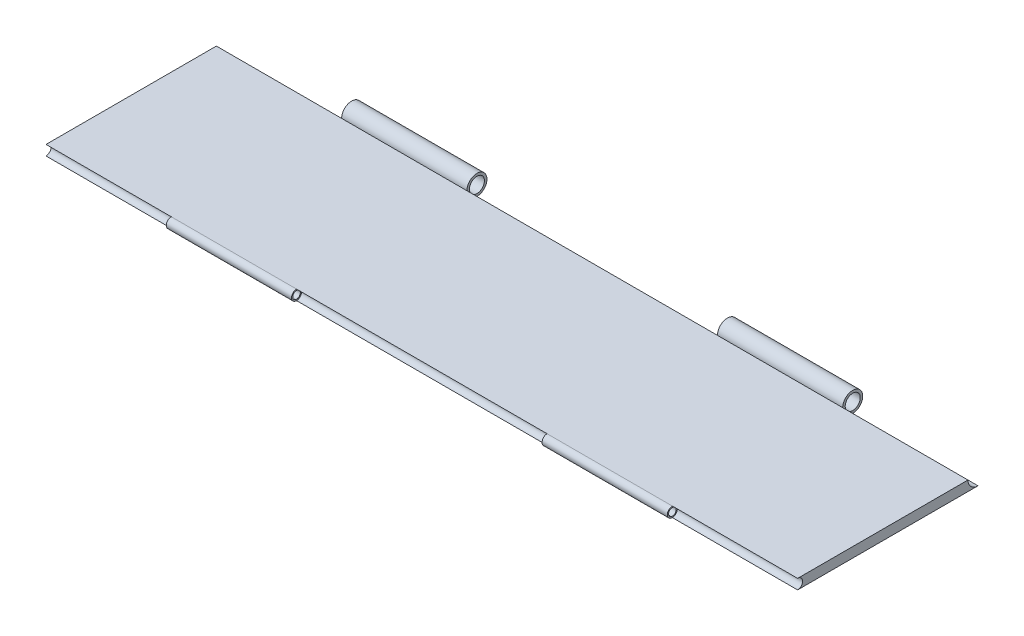
ISO-10303-21;
HEADER;
FILE_DESCRIPTION(('STEP AP214'),'2;1');
FILE_NAME('part.step','',(''),(''),'','','');
FILE_SCHEMA(('AUTOMOTIVE_DESIGN { 1 0 10303 214 1 1 1 1 }'));
ENDSEC;
DATA;
#1=APPLICATION_CONTEXT('core data for automotive mechanical design processes');
#2=APPLICATION_PROTOCOL_DEFINITION('international standard','automotive_design',2000,#1);
#3=PRODUCT_CONTEXT('',#1,'mechanical');
#4=PRODUCT('Part','Part','',(#3));
#5=PRODUCT_RELATED_PRODUCT_CATEGORY('part','',(#4));
#6=PRODUCT_DEFINITION_FORMATION('','',#4);
#7=PRODUCT_DEFINITION_CONTEXT('part definition',#1,'design');
#8=PRODUCT_DEFINITION('design','',#6,#7);
#9=PRODUCT_DEFINITION_SHAPE('','',#8);
#10=(LENGTH_UNIT() NAMED_UNIT(*) SI_UNIT(.MILLI.,.METRE.));
#11=(NAMED_UNIT(*) PLANE_ANGLE_UNIT() SI_UNIT($,.RADIAN.));
#12=(NAMED_UNIT(*) SI_UNIT($,.STERADIAN.) SOLID_ANGLE_UNIT());
#13=UNCERTAINTY_MEASURE_WITH_UNIT(LENGTH_MEASURE(1.E-05),#10,'distance_accuracy_value','');
#14=(GEOMETRIC_REPRESENTATION_CONTEXT(3) GLOBAL_UNCERTAINTY_ASSIGNED_CONTEXT((#13)) GLOBAL_UNIT_ASSIGNED_CONTEXT((#10,
#11,#12)) REPRESENTATION_CONTEXT('',''));
#15=CARTESIAN_POINT('',(0.,0.,0.));
#16=DIRECTION('',(0.,0.,1.));
#17=DIRECTION('',(1.,0.,0.));
#18=AXIS2_PLACEMENT_3D('',#15,#16,#17);
#19=CARTESIAN_POINT('',(98.0225988700565,8.,-5.95350282485887));
#20=DIRECTION('',(1.,0.,0.));
#21=DIRECTION('',(0.,0.,-1.));
#22=AXIS2_PLACEMENT_3D('',#19,#20,#21);
#23=PLANE('',#22);
#24=CARTESIAN_POINT('',(98.0225988700565,4.,-1.94350282485878));
#25=DIRECTION('',(1.,0.,0.));
#26=DIRECTION('',(0.,0.,-1.));
#27=AXIS2_PLACEMENT_3D('',#24,#25,#26);
#28=CIRCLE('',#27,3.);
#29=CARTESIAN_POINT('',(98.0225988700565,4.,-4.94350282485878));
#30=VERTEX_POINT('',#29);
#31=EDGE_CURVE('E72',#30,#30,#28,.F.);
#32=ORIENTED_EDGE('',*,*,#31,.T.);
#33=EDGE_LOOP('',(#32));
#34=FACE_BOUND('',#33,.T.);
#35=CARTESIAN_POINT('',(98.0225988700565,4.,-1.94350282485878));
#36=DIRECTION('',(1.,0.,0.));
#37=DIRECTION('',(0.,0.,-1.));
#38=AXIS2_PLACEMENT_3D('',#35,#36,#37);
#39=CIRCLE('',#38,4.);
#40=CARTESIAN_POINT('',(98.0225988700565,4.,-5.94350282485878));
#41=VERTEX_POINT('',#40);
#42=EDGE_CURVE('E64',#41,#41,#39,.F.);
#43=ORIENTED_EDGE('',*,*,#42,.F.);
#44=EDGE_LOOP('',(#43));
#45=FACE_BOUND('',#44,.T.);
#46=ADVANCED_FACE('F60',(#34,#45),#23,.T.);
#47=CARTESIAN_POINT('',(48.0225988700565,7.99999999999999,-5.95350282485887));
#48=DIRECTION('',(-1.,0.,0.));
#49=DIRECTION('',(0.,0.,1.));
#50=AXIS2_PLACEMENT_3D('',#47,#48,#49);
#51=PLANE('',#50);
#52=CARTESIAN_POINT('',(48.0225988700565,4.,-1.9435028248588));
#53=DIRECTION('',(-1.,0.,0.));
#54=DIRECTION('',(0.,0.,1.));
#55=AXIS2_PLACEMENT_3D('',#52,#53,#54);
#56=CIRCLE('',#55,3.);
#57=CARTESIAN_POINT('',(48.0225988700565,4.,1.0564971751412));
#58=VERTEX_POINT('',#57);
#59=EDGE_CURVE('E74',#58,#58,#56,.F.);
#60=ORIENTED_EDGE('',*,*,#59,.T.);
#61=EDGE_LOOP('',(#60));
#62=FACE_BOUND('',#61,.T.);
#63=CARTESIAN_POINT('',(48.0225988700565,4.,-1.9435028248588));
#64=DIRECTION('',(-1.,0.,0.));
#65=DIRECTION('',(0.,0.,1.));
#66=AXIS2_PLACEMENT_3D('',#63,#64,#65);
#67=CIRCLE('',#66,4.);
#68=CARTESIAN_POINT('',(48.0225988700565,4.,2.0564971751412));
#69=VERTEX_POINT('',#68);
#70=EDGE_CURVE('E12',#69,#69,#67,.F.);
#71=ORIENTED_EDGE('',*,*,#70,.F.);
#72=EDGE_LOOP('',(#71));
#73=FACE_BOUND('',#72,.T.);
#74=ADVANCED_FACE('F81',(#62,#73),#51,.T.);
#75=CARTESIAN_POINT('',(-151.977401129944,4.,-1.94350282485888));
#76=DIRECTION('',(1.,0.,0.));
#77=DIRECTION('',(0.,0.,-1.));
#78=AXIS2_PLACEMENT_3D('',#75,#76,#77);
#79=CYLINDRICAL_SURFACE('',#78,3.);
#80=ORIENTED_EDGE('',*,*,#59,.F.);
#81=EDGE_LOOP('',(#80));
#82=FACE_BOUND('',#81,.T.);
#83=ORIENTED_EDGE('',*,*,#31,.F.);
#84=EDGE_LOOP('',(#83));
#85=FACE_BOUND('',#84,.T.);
#86=ADVANCED_FACE('F84',(#82,#85),#79,.F.);
#87=CARTESIAN_POINT('',(-151.977401129944,4.,-1.94350282485888));
#88=DIRECTION('',(1.,0.,0.));
#89=DIRECTION('',(0.,0.,-1.));
#90=AXIS2_PLACEMENT_3D('',#87,#88,#89);
#91=CYLINDRICAL_SURFACE('',#90,4.);
#92=ORIENTED_EDGE('',*,*,#70,.T.);
#93=EDGE_LOOP('',(#92));
#94=FACE_BOUND('',#93,.T.);
#95=ORIENTED_EDGE('',*,*,#42,.T.);
#96=EDGE_LOOP('',(#95));
#97=FACE_BOUND('',#96,.T.);
#98=ADVANCED_FACE('F62',(#94,#97),#91,.T.);
#99=CLOSED_SHELL('',(#46,#74,#86,#98));
#100=MANIFOLD_SOLID_BREP('B2',#99);
#101=CARTESIAN_POINT('',(-51.9774011299435,8.,-5.95350282485887));
#102=DIRECTION('',(1.,0.,0.));
#103=DIRECTION('',(0.,0.,-1.));
#104=AXIS2_PLACEMENT_3D('',#101,#102,#103);
#105=PLANE('',#104);
#106=CARTESIAN_POINT('',(-51.9774011299435,4.,-1.94350282485884));
#107=DIRECTION('',(1.,0.,0.));
#108=DIRECTION('',(0.,0.,-1.));
#109=AXIS2_PLACEMENT_3D('',#106,#107,#108);
#110=CIRCLE('',#109,3.);
#111=CARTESIAN_POINT('',(-51.9774011299435,4.,-4.94350282485884));
#112=VERTEX_POINT('',#111);
#113=EDGE_CURVE('E135',#112,#112,#110,.F.);
#114=ORIENTED_EDGE('',*,*,#113,.T.);
#115=EDGE_LOOP('',(#114));
#116=FACE_BOUND('',#115,.T.);
#117=CARTESIAN_POINT('',(-51.9774011299435,4.,-1.94350282485884));
#118=DIRECTION('',(1.,0.,0.));
#119=DIRECTION('',(0.,0.,-1.));
#120=AXIS2_PLACEMENT_3D('',#117,#118,#119);
#121=CIRCLE('',#120,4.);
#122=CARTESIAN_POINT('',(-51.9774011299435,4.,-5.94350282485884));
#123=VERTEX_POINT('',#122);
#124=EDGE_CURVE('E139',#123,#123,#121,.F.);
#125=ORIENTED_EDGE('',*,*,#124,.F.);
#126=EDGE_LOOP('',(#125));
#127=FACE_BOUND('',#126,.T.);
#128=ADVANCED_FACE('F131',(#116,#127),#105,.T.);
#129=CARTESIAN_POINT('',(-101.977401129944,7.99999999999999,-5.95350282485887));
#130=DIRECTION('',(-1.,0.,0.));
#131=DIRECTION('',(0.,0.,1.));
#132=AXIS2_PLACEMENT_3D('',#129,#130,#131);
#133=PLANE('',#132);
#134=CARTESIAN_POINT('',(-101.977401129944,4.,-1.94350282485886));
#135=DIRECTION('',(-1.,0.,0.));
#136=DIRECTION('',(0.,0.,1.));
#137=AXIS2_PLACEMENT_3D('',#134,#135,#136);
#138=CIRCLE('',#137,3.);
#139=CARTESIAN_POINT('',(-101.977401129944,4.,1.05649717514114));
#140=VERTEX_POINT('',#139);
#141=EDGE_CURVE('E145',#140,#140,#138,.F.);
#142=ORIENTED_EDGE('',*,*,#141,.T.);
#143=EDGE_LOOP('',(#142));
#144=FACE_BOUND('',#143,.T.);
#145=CARTESIAN_POINT('',(-101.977401129944,4.,-1.94350282485886));
#146=DIRECTION('',(-1.,0.,0.));
#147=DIRECTION('',(0.,0.,1.));
#148=AXIS2_PLACEMENT_3D('',#145,#146,#147);
#149=CIRCLE('',#148,4.);
#150=CARTESIAN_POINT('',(-101.977401129944,4.,2.05649717514114));
#151=VERTEX_POINT('',#150);
#152=EDGE_CURVE('E59',#151,#151,#149,.F.);
#153=ORIENTED_EDGE('',*,*,#152,.F.);
#154=EDGE_LOOP('',(#153));
#155=FACE_BOUND('',#154,.T.);
#156=ADVANCED_FACE('F156',(#144,#155),#133,.T.);
#157=CARTESIAN_POINT('',(-151.977401129944,4.,-1.94350282485888));
#158=DIRECTION('',(1.,0.,0.));
#159=DIRECTION('',(0.,0.,-1.));
#160=AXIS2_PLACEMENT_3D('',#157,#158,#159);
#161=CYLINDRICAL_SURFACE('',#160,3.);
#162=ORIENTED_EDGE('',*,*,#141,.F.);
#163=EDGE_LOOP('',(#162));
#164=FACE_BOUND('',#163,.T.);
#165=ORIENTED_EDGE('',*,*,#113,.F.);
#166=EDGE_LOOP('',(#165));
#167=FACE_BOUND('',#166,.T.);
#168=ADVANCED_FACE('F154',(#164,#167),#161,.F.);
#169=CARTESIAN_POINT('',(-151.977401129944,4.,-1.94350282485888));
#170=DIRECTION('',(1.,0.,0.));
#171=DIRECTION('',(0.,0.,-1.));
#172=AXIS2_PLACEMENT_3D('',#169,#170,#171);
#173=CYLINDRICAL_SURFACE('',#172,4.);
#174=ORIENTED_EDGE('',*,*,#152,.T.);
#175=EDGE_LOOP('',(#174));
#176=FACE_BOUND('',#175,.T.);
#177=ORIENTED_EDGE('',*,*,#124,.T.);
#178=EDGE_LOOP('',(#177));
#179=FACE_BOUND('',#178,.T.);
#180=ADVANCED_FACE('F133',(#176,#179),#173,.T.);
#181=CLOSED_SHELL('',(#128,#156,#168,#180));
#182=MANIFOLD_SOLID_BREP('B7',#181);
#183=CARTESIAN_POINT('',(-151.977401129944,2.,70.0564971751411));
#184=DIRECTION('',(1.,0.,0.));
#185=DIRECTION('',(0.,0.,-1.));
#186=AXIS2_PLACEMENT_3D('',#183,#184,#185);
#187=CYLINDRICAL_SURFACE('',#186,2.);
#188=CARTESIAN_POINT('',(48.0225988700565,2.,70.0564971751412));
#189=DIRECTION('',(1.,0.,0.));
#190=DIRECTION('',(0.,0.,-1.));
#191=AXIS2_PLACEMENT_3D('',#188,#189,#190);
#192=CIRCLE('',#191,2.);
#193=CARTESIAN_POINT('',(48.0225988700565,4.,70.0564971751412));
#194=VERTEX_POINT('',#193);
#195=CARTESIAN_POINT('',(48.0225988700565,0.,70.0564971751412));
#196=VERTEX_POINT('',#195);
#197=EDGE_CURVE('E129',#194,#196,#192,.F.);
#198=ORIENTED_EDGE('',*,*,#197,.F.);
#199=DIRECTION('',(1.,0.,0.));
#200=VECTOR('',#199,1.);
#201=CARTESIAN_POINT('',(-151.977401129944,4.,70.0564971751412));
#202=LINE('',#201,#200);
#203=CARTESIAN_POINT('',(-51.9774011299435,4.,70.0564971751412));
#204=VERTEX_POINT('',#203);
#205=EDGE_CURVE('E215',#204,#194,#202,.T.);
#206=ORIENTED_EDGE('',*,*,#205,.F.);
#207=CARTESIAN_POINT('',(-51.9774011299435,2.,70.0564971751412));
#208=DIRECTION('',(1.,0.,0.));
#209=DIRECTION('',(0.,0.,-1.));
#210=AXIS2_PLACEMENT_3D('',#207,#208,#209);
#211=CIRCLE('',#210,2.);
#212=CARTESIAN_POINT('',(-51.9774011299435,0.,70.0564971751412));
#213=VERTEX_POINT('',#212);
#214=EDGE_CURVE('E260',#204,#213,#211,.F.);
#215=ORIENTED_EDGE('',*,*,#214,.T.);
#216=DIRECTION('',(1.,0.,0.));
#217=VECTOR('',#216,1.);
#218=CARTESIAN_POINT('',(-151.977401129944,0.,70.0564971751412));
#219=LINE('',#218,#217);
#220=EDGE_CURVE('E311',#213,#196,#219,.T.);
#221=ORIENTED_EDGE('',*,*,#220,.T.);
#222=EDGE_LOOP('',(#198,#206,#215,#221));
#223=FACE_BOUND('',#222,.T.);
#224=ADVANCED_FACE('F193',(#223),#187,.F.);
#225=CARTESIAN_POINT('',(-101.977401129944,2.,70.0564971751411));
#226=DIRECTION('',(1.,0.,0.));
#227=DIRECTION('',(0.,0.,-1.));
#228=AXIS2_PLACEMENT_3D('',#225,#226,#227);
#229=CIRCLE('',#228,2.);
#230=CARTESIAN_POINT('',(-101.977401129944,4.,70.0564971751412));
#231=VERTEX_POINT('',#230);
#232=CARTESIAN_POINT('',(-101.977401129944,0.,70.0564971751412));
#233=VERTEX_POINT('',#232);
#234=EDGE_CURVE('E292',#231,#233,#229,.F.);
#235=ORIENTED_EDGE('',*,*,#234,.F.);
#236=CARTESIAN_POINT('',(-151.977401129944,4.,70.0564971751411));
#237=VERTEX_POINT('',#236);
#238=EDGE_CURVE('E282',#237,#231,#202,.T.);
#239=ORIENTED_EDGE('',*,*,#238,.F.);
#240=CARTESIAN_POINT('',(-151.977401129944,2.,70.0564971751411));
#241=DIRECTION('',(1.,0.,0.));
#242=DIRECTION('',(0.,0.,-1.));
#243=AXIS2_PLACEMENT_3D('',#240,#241,#242);
#244=CIRCLE('',#243,2.);
#245=CARTESIAN_POINT('',(-151.977401129944,0.,70.0564971751412));
#246=VERTEX_POINT('',#245);
#247=EDGE_CURVE('E331',#246,#237,#244,.T.);
#248=ORIENTED_EDGE('',*,*,#247,.F.);
#249=EDGE_CURVE('E298',#246,#233,#219,.T.);
#250=ORIENTED_EDGE('',*,*,#249,.T.);
#251=EDGE_LOOP('',(#235,#239,#248,#250));
#252=FACE_BOUND('',#251,.T.);
#253=ADVANCED_FACE('F359',(#252),#187,.F.);
#254=CARTESIAN_POINT('',(-151.977401129943,4.,-1.94350282485876));
#255=DIRECTION('',(1.,0.,0.));
#256=DIRECTION('',(0.,0.,-1.));
#257=AXIS2_PLACEMENT_3D('',#254,#255,#256);
#258=PLANE('',#257);
#259=DIRECTION('',(0.,0.,1.));
#260=VECTOR('',#259,1.);
#261=CARTESIAN_POINT('',(-151.977401129943,0.,-1.94350282485876));
#262=LINE('',#261,#260);
#263=CARTESIAN_POINT('',(-151.977401129944,0.,-1.94350282485888));
#264=VERTEX_POINT('',#263);
#265=EDGE_CURVE('E293',#264,#246,#262,.T.);
#266=ORIENTED_EDGE('',*,*,#265,.T.);
#267=ORIENTED_EDGE('',*,*,#247,.T.);
#268=DIRECTION('',(0.,0.,1.));
#269=VECTOR('',#268,1.);
#270=CARTESIAN_POINT('',(-151.977401129943,4.,-1.94350282485876));
#271=LINE('',#270,#269);
#272=CARTESIAN_POINT('',(-151.977401129944,4.,2.05649717514113));
#273=VERTEX_POINT('',#272);
#274=EDGE_CURVE('E280',#273,#237,#271,.T.);
#275=ORIENTED_EDGE('',*,*,#274,.F.);
#276=CARTESIAN_POINT('',(-151.977401129944,4.,-1.94350282485888));
#277=DIRECTION('',(1.,0.,0.));
#278=DIRECTION('',(0.,0.,-1.));
#279=AXIS2_PLACEMENT_3D('',#276,#277,#278);
#280=CIRCLE('',#279,4.);
#281=EDGE_CURVE('E342',#273,#264,#280,.T.);
#282=ORIENTED_EDGE('',*,*,#281,.T.);
#283=EDGE_LOOP('',(#266,#267,#275,#282));
#284=FACE_BOUND('',#283,.T.);
#285=ADVANCED_FACE('F195',(#284),#258,.F.);
#286=CARTESIAN_POINT('',(148.022598870057,4.,-1.94350282485876));
#287=DIRECTION('',(-1.,0.,0.));
#288=DIRECTION('',(0.,0.,1.));
#289=AXIS2_PLACEMENT_3D('',#286,#287,#288);
#290=PLANE('',#289);
#291=DIRECTION('',(0.,0.,-1.));
#292=VECTOR('',#291,1.);
#293=CARTESIAN_POINT('',(148.022598870057,4.,-1.94350282485876));
#294=LINE('',#293,#292);
#295=CARTESIAN_POINT('',(148.022598870056,4.,70.0564971751412));
#296=VERTEX_POINT('',#295);
#297=CARTESIAN_POINT('',(148.022598870057,4.,2.05649717514124));
#298=VERTEX_POINT('',#297);
#299=EDGE_CURVE('E289',#296,#298,#294,.T.);
#300=ORIENTED_EDGE('',*,*,#299,.F.);
#301=CARTESIAN_POINT('',(148.022598870056,2.,70.0564971751412));
#302=DIRECTION('',(1.,0.,0.));
#303=DIRECTION('',(0.,0.,-1.));
#304=AXIS2_PLACEMENT_3D('',#301,#302,#303);
#305=CIRCLE('',#304,2.);
#306=CARTESIAN_POINT('',(148.022598870056,0.,70.0564971751412));
#307=VERTEX_POINT('',#306);
#308=EDGE_CURVE('E276',#307,#296,#305,.T.);
#309=ORIENTED_EDGE('',*,*,#308,.F.);
#310=DIRECTION('',(0.,0.,-1.));
#311=VECTOR('',#310,1.);
#312=CARTESIAN_POINT('',(148.022598870057,0.,-1.94350282485876));
#313=LINE('',#312,#311);
#314=CARTESIAN_POINT('',(148.022598870057,0.,-1.94350282485876));
#315=VERTEX_POINT('',#314);
#316=EDGE_CURVE('E300',#307,#315,#313,.T.);
#317=ORIENTED_EDGE('',*,*,#316,.T.);
#318=CARTESIAN_POINT('',(148.022598870057,4.,-1.94350282485876));
#319=DIRECTION('',(1.,0.,0.));
#320=DIRECTION('',(0.,0.,-1.));
#321=AXIS2_PLACEMENT_3D('',#318,#319,#320);
#322=CIRCLE('',#321,4.);
#323=EDGE_CURVE('E340',#298,#315,#322,.T.);
#324=ORIENTED_EDGE('',*,*,#323,.F.);
#325=EDGE_LOOP('',(#300,#309,#317,#324));
#326=FACE_BOUND('',#325,.T.);
#327=ADVANCED_FACE('F351',(#326),#290,.F.);
#328=CARTESIAN_POINT('',(0.,4.,0.));
#329=DIRECTION('',(0.,1.,0.));
#330=DIRECTION('',(0.,0.,1.));
#331=AXIS2_PLACEMENT_3D('',#328,#329,#330);
#332=PLANE('',#331);
#333=DIRECTION('',(1.,0.,0.));
#334=VECTOR('',#333,1.);
#335=CARTESIAN_POINT('',(-151.977401129944,4.,2.05649717514113));
#336=LINE('',#335,#334);
#337=EDGE_CURVE('E297',#273,#298,#336,.T.);
#338=ORIENTED_EDGE('',*,*,#337,.F.);
#339=ORIENTED_EDGE('',*,*,#274,.T.);
#340=ORIENTED_EDGE('',*,*,#238,.T.);
#341=EDGE_CURVE('E285',#231,#204,#202,.T.);
#342=ORIENTED_EDGE('',*,*,#341,.T.);
#343=ORIENTED_EDGE('',*,*,#205,.T.);
#344=CARTESIAN_POINT('',(98.0225988700565,4.,70.0564971751412));
#345=VERTEX_POINT('',#344);
#346=EDGE_CURVE('E265',#194,#345,#202,.T.);
#347=ORIENTED_EDGE('',*,*,#346,.T.);
#348=EDGE_CURVE('E273',#345,#296,#202,.T.);
#349=ORIENTED_EDGE('',*,*,#348,.T.);
#350=ORIENTED_EDGE('',*,*,#299,.T.);
#351=EDGE_LOOP('',(#338,#339,#340,#342,#343,#347,#349,#350));
#352=FACE_BOUND('',#351,.T.);
#353=ADVANCED_FACE('F284',(#352),#332,.T.);
#354=CARTESIAN_POINT('',(0.,0.,0.));
#355=DIRECTION('',(0.,1.,0.));
#356=DIRECTION('',(0.,0.,1.));
#357=AXIS2_PLACEMENT_3D('',#354,#355,#356);
#358=PLANE('',#357);
#359=ORIENTED_EDGE('',*,*,#265,.F.);
#360=DIRECTION('',(-1.,0.,0.));
#361=VECTOR('',#360,1.);
#362=CARTESIAN_POINT('',(-151.977401129943,0.,-1.94350282485876));
#363=LINE('',#362,#361);
#364=EDGE_CURVE('E304',#315,#264,#363,.T.);
#365=ORIENTED_EDGE('',*,*,#364,.F.);
#366=ORIENTED_EDGE('',*,*,#316,.F.);
#367=CARTESIAN_POINT('',(98.0225988700565,0.,70.0564971751412));
#368=VERTEX_POINT('',#367);
#369=EDGE_CURVE('E296',#368,#307,#219,.T.);
#370=ORIENTED_EDGE('',*,*,#369,.F.);
#371=EDGE_CURVE('E268',#196,#368,#219,.T.);
#372=ORIENTED_EDGE('',*,*,#371,.F.);
#373=ORIENTED_EDGE('',*,*,#220,.F.);
#374=EDGE_CURVE('E301',#233,#213,#219,.T.);
#375=ORIENTED_EDGE('',*,*,#374,.F.);
#376=ORIENTED_EDGE('',*,*,#249,.F.);
#377=EDGE_LOOP('',(#359,#365,#366,#370,#372,#373,#375,#376));
#378=FACE_BOUND('',#377,.T.);
#379=ADVANCED_FACE('F319',(#378),#358,.F.);
#380=CARTESIAN_POINT('',(-151.977401129944,4.,-1.94350282485888));
#381=DIRECTION('',(1.,0.,0.));
#382=DIRECTION('',(0.,0.,-1.));
#383=AXIS2_PLACEMENT_3D('',#380,#381,#382);
#384=CYLINDRICAL_SURFACE('',#383,4.);
#385=ORIENTED_EDGE('',*,*,#337,.T.);
#386=ORIENTED_EDGE('',*,*,#323,.T.);
#387=ORIENTED_EDGE('',*,*,#364,.T.);
#388=ORIENTED_EDGE('',*,*,#281,.F.);
#389=EDGE_LOOP('',(#385,#386,#387,#388));
#390=FACE_BOUND('',#389,.T.);
#391=ADVANCED_FACE('F347',(#390),#384,.F.);
#392=ORIENTED_EDGE('',*,*,#348,.F.);
#393=CARTESIAN_POINT('',(98.0225988700565,2.,70.0564971751412));
#394=DIRECTION('',(1.,0.,0.));
#395=DIRECTION('',(0.,0.,-1.));
#396=AXIS2_PLACEMENT_3D('',#393,#394,#395);
#397=CIRCLE('',#396,2.);
#398=EDGE_CURVE('E201',#345,#368,#397,.F.);
#399=ORIENTED_EDGE('',*,*,#398,.T.);
#400=ORIENTED_EDGE('',*,*,#369,.T.);
#401=ORIENTED_EDGE('',*,*,#308,.T.);
#402=EDGE_LOOP('',(#392,#399,#400,#401));
#403=FACE_BOUND('',#402,.T.);
#404=ADVANCED_FACE('F274',(#403),#187,.F.);
#405=CARTESIAN_POINT('',(-51.9774011299435,2.,70.0564971751411));
#406=DIRECTION('',(1.,0.,0.));
#407=DIRECTION('',(0.,0.,-1.));
#408=AXIS2_PLACEMENT_3D('',#405,#406,#407);
#409=PLANE('',#408);
#410=CARTESIAN_POINT('',(-51.9774011299435,2.,70.0564971751411));
#411=DIRECTION('',(1.,0.,0.));
#412=DIRECTION('',(0.,0.,-1.));
#413=AXIS2_PLACEMENT_3D('',#410,#411,#412);
#414=CIRCLE('',#413,2.);
#415=EDGE_CURVE('E325',#204,#213,#414,.T.);
#416=ORIENTED_EDGE('',*,*,#415,.T.);
#417=ORIENTED_EDGE('',*,*,#214,.F.);
#418=EDGE_LOOP('',(#416,#417));
#419=FACE_BOUND('',#418,.T.);
#420=CARTESIAN_POINT('',(-51.9774011299435,2.,70.0564971751411));
#421=DIRECTION('',(1.,0.,0.));
#422=DIRECTION('',(0.,0.,-1.));
#423=AXIS2_PLACEMENT_3D('',#420,#421,#422);
#424=CIRCLE('',#423,1.5);
#425=CARTESIAN_POINT('',(-51.9774011299435,2.,68.5564971751411));
#426=VERTEX_POINT('',#425);
#427=EDGE_CURVE('E333',#426,#426,#424,.T.);
#428=ORIENTED_EDGE('',*,*,#427,.F.);
#429=EDGE_LOOP('',(#428));
#430=FACE_BOUND('',#429,.T.);
#431=ADVANCED_FACE('F328',(#419,#430),#409,.T.);
#432=CARTESIAN_POINT('',(-101.977401129944,2.,70.0564971751411));
#433=DIRECTION('',(1.,0.,0.));
#434=DIRECTION('',(0.,0.,-1.));
#435=AXIS2_PLACEMENT_3D('',#432,#433,#434);
#436=PLANE('',#435);
#437=CARTESIAN_POINT('',(-101.977401129944,2.,70.0564971751411));
#438=DIRECTION('',(1.,0.,0.));
#439=DIRECTION('',(0.,0.,-1.));
#440=AXIS2_PLACEMENT_3D('',#437,#438,#439);
#441=CIRCLE('',#440,2.);
#442=EDGE_CURVE('E327',#231,#233,#441,.T.);
#443=ORIENTED_EDGE('',*,*,#442,.F.);
#444=ORIENTED_EDGE('',*,*,#234,.T.);
#445=EDGE_LOOP('',(#443,#444));
#446=FACE_BOUND('',#445,.T.);
#447=CARTESIAN_POINT('',(-101.977401129944,2.,70.0564971751411));
#448=DIRECTION('',(1.,0.,0.));
#449=DIRECTION('',(0.,0.,-1.));
#450=AXIS2_PLACEMENT_3D('',#447,#448,#449);
#451=CIRCLE('',#450,1.5);
#452=CARTESIAN_POINT('',(-101.977401129944,2.,68.5564971751411));
#453=VERTEX_POINT('',#452);
#454=EDGE_CURVE('E336',#453,#453,#451,.T.);
#455=ORIENTED_EDGE('',*,*,#454,.T.);
#456=EDGE_LOOP('',(#455));
#457=FACE_BOUND('',#456,.T.);
#458=ADVANCED_FACE('F357',(#446,#457),#436,.F.);
#459=CARTESIAN_POINT('',(-51.9774011299435,2.,70.0564971751411));
#460=DIRECTION('',(-1.,0.,0.));
#461=DIRECTION('',(0.,0.,1.));
#462=AXIS2_PLACEMENT_3D('',#459,#460,#461);
#463=CYLINDRICAL_SURFACE('',#462,2.);
#464=ORIENTED_EDGE('',*,*,#341,.F.);
#465=ORIENTED_EDGE('',*,*,#442,.T.);
#466=ORIENTED_EDGE('',*,*,#374,.T.);
#467=ORIENTED_EDGE('',*,*,#415,.F.);
#468=EDGE_LOOP('',(#464,#465,#466,#467));
#469=FACE_BOUND('',#468,.T.);
#470=ADVANCED_FACE('F324',(#469),#463,.T.);
#471=CARTESIAN_POINT('',(-51.9774011299435,2.,70.0564971751411));
#472=DIRECTION('',(-1.,0.,0.));
#473=DIRECTION('',(0.,0.,1.));
#474=AXIS2_PLACEMENT_3D('',#471,#472,#473);
#475=CYLINDRICAL_SURFACE('',#474,1.5);
#476=ORIENTED_EDGE('',*,*,#427,.T.);
#477=EDGE_LOOP('',(#476));
#478=FACE_BOUND('',#477,.T.);
#479=ORIENTED_EDGE('',*,*,#454,.F.);
#480=EDGE_LOOP('',(#479));
#481=FACE_BOUND('',#480,.T.);
#482=ADVANCED_FACE('F410',(#478,#481),#475,.F.);
#483=CARTESIAN_POINT('',(48.0225988700565,2.,70.0564971751412));
#484=DIRECTION('',(1.,0.,0.));
#485=DIRECTION('',(0.,0.,-1.));
#486=AXIS2_PLACEMENT_3D('',#483,#484,#485);
#487=CYLINDRICAL_SURFACE('',#486,2.);
#488=ORIENTED_EDGE('',*,*,#346,.F.);
#489=CARTESIAN_POINT('',(48.0225988700565,2.,70.0564971751412));
#490=DIRECTION('',(1.,0.,0.));
#491=DIRECTION('',(0.,0.,-1.));
#492=AXIS2_PLACEMENT_3D('',#489,#490,#491);
#493=CIRCLE('',#492,2.);
#494=EDGE_CURVE('E269',#194,#196,#493,.T.);
#495=ORIENTED_EDGE('',*,*,#494,.T.);
#496=ORIENTED_EDGE('',*,*,#371,.T.);
#497=CARTESIAN_POINT('',(98.0225988700565,2.,70.0564971751412));
#498=DIRECTION('',(1.,0.,0.));
#499=DIRECTION('',(0.,0.,-1.));
#500=AXIS2_PLACEMENT_3D('',#497,#498,#499);
#501=CIRCLE('',#500,2.);
#502=EDGE_CURVE('E207',#345,#368,#501,.T.);
#503=ORIENTED_EDGE('',*,*,#502,.F.);
#504=EDGE_LOOP('',(#488,#495,#496,#503));
#505=FACE_BOUND('',#504,.T.);
#506=ADVANCED_FACE('F262',(#505),#487,.T.);
#507=CARTESIAN_POINT('',(48.0225988700565,2.,70.0564971751412));
#508=DIRECTION('',(1.,0.,0.));
#509=DIRECTION('',(0.,0.,-1.));
#510=AXIS2_PLACEMENT_3D('',#507,#508,#509);
#511=PLANE('',#510);
#512=CARTESIAN_POINT('',(48.0225988700565,2.,70.0564971751412));
#513=DIRECTION('',(1.,0.,0.));
#514=DIRECTION('',(0.,0.,-1.));
#515=AXIS2_PLACEMENT_3D('',#512,#513,#514);
#516=CIRCLE('',#515,1.5);
#517=CARTESIAN_POINT('',(48.0225988700565,2.,68.5564971751412));
#518=VERTEX_POINT('',#517);
#519=EDGE_CURVE('E270',#518,#518,#516,.T.);
#520=ORIENTED_EDGE('',*,*,#519,.T.);
#521=EDGE_LOOP('',(#520));
#522=FACE_BOUND('',#521,.T.);
#523=ORIENTED_EDGE('',*,*,#494,.F.);
#524=ORIENTED_EDGE('',*,*,#197,.T.);
#525=EDGE_LOOP('',(#523,#524));
#526=FACE_BOUND('',#525,.T.);
#527=ADVANCED_FACE('F409',(#522,#526),#511,.F.);
#528=CARTESIAN_POINT('',(98.0225988700565,2.,70.0564971751412));
#529=DIRECTION('',(1.,0.,0.));
#530=DIRECTION('',(0.,0.,-1.));
#531=AXIS2_PLACEMENT_3D('',#528,#529,#530);
#532=PLANE('',#531);
#533=CARTESIAN_POINT('',(98.0225988700565,2.,70.0564971751412));
#534=DIRECTION('',(1.,0.,0.));
#535=DIRECTION('',(0.,0.,-1.));
#536=AXIS2_PLACEMENT_3D('',#533,#534,#535);
#537=CIRCLE('',#536,1.5);
#538=CARTESIAN_POINT('',(98.0225988700565,2.,68.5564971751412));
#539=VERTEX_POINT('',#538);
#540=EDGE_CURVE('E489',#539,#539,#537,.T.);
#541=ORIENTED_EDGE('',*,*,#540,.F.);
#542=EDGE_LOOP('',(#541));
#543=FACE_BOUND('',#542,.T.);
#544=ORIENTED_EDGE('',*,*,#502,.T.);
#545=ORIENTED_EDGE('',*,*,#398,.F.);
#546=EDGE_LOOP('',(#544,#545));
#547=FACE_BOUND('',#546,.T.);
#548=ADVANCED_FACE('F256',(#543,#547),#532,.T.);
#549=CARTESIAN_POINT('',(48.0225988700565,2.,70.0564971751412));
#550=DIRECTION('',(1.,0.,0.));
#551=DIRECTION('',(0.,0.,-1.));
#552=AXIS2_PLACEMENT_3D('',#549,#550,#551);
#553=CYLINDRICAL_SURFACE('',#552,1.5);
#554=ORIENTED_EDGE('',*,*,#519,.F.);
#555=EDGE_LOOP('',(#554));
#556=FACE_BOUND('',#555,.T.);
#557=ORIENTED_EDGE('',*,*,#540,.T.);
#558=EDGE_LOOP('',(#557));
#559=FACE_BOUND('',#558,.T.);
#560=ADVANCED_FACE('F430',(#556,#559),#553,.F.);
#561=CLOSED_SHELL('',(#224,#253,#285,#327,#353,#379,#391,#404,#431,#458,#470,#482,#506,#527,
#548,#560));
#562=MANIFOLD_SOLID_BREP('B54',#561);
#563=ADVANCED_BREP_SHAPE_REPRESENTATION('',(#18,#100,#182,#562),#14);
#564=SHAPE_DEFINITION_REPRESENTATION(#9,#563);
ENDSEC;
END-ISO-10303-21;
